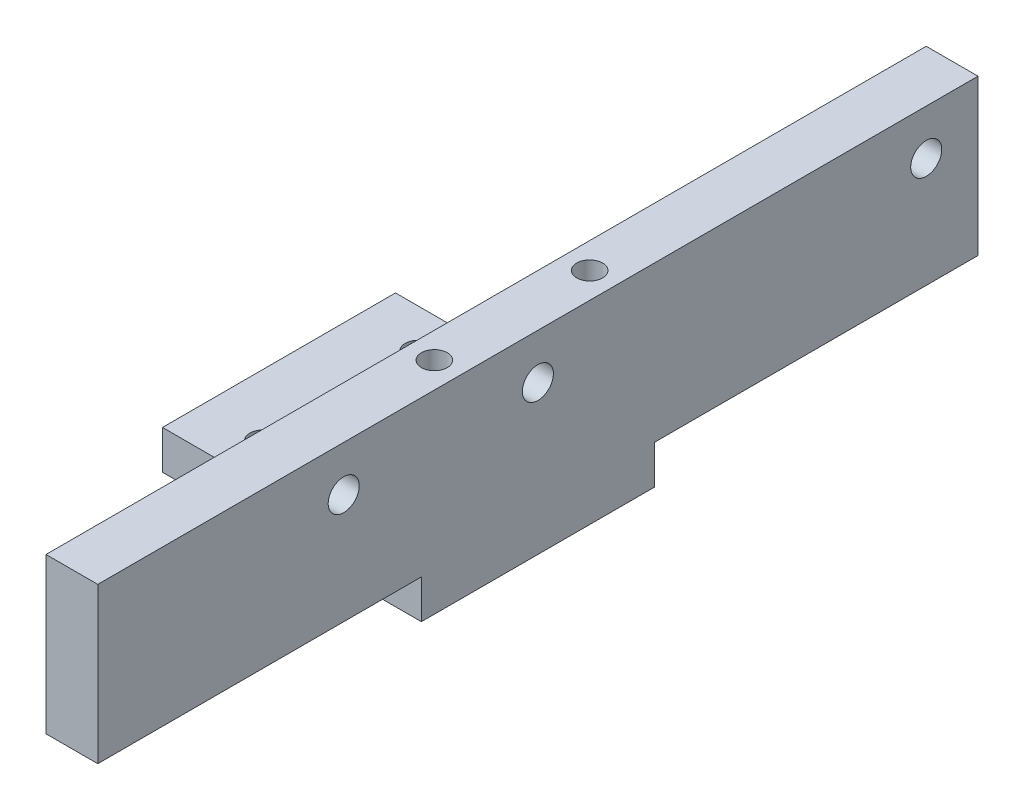
ISO-10303-21;
HEADER;
FILE_DESCRIPTION(('STEP AP214'),'2;1');
FILE_NAME('part.step','',(''),(''),'','','');
FILE_SCHEMA(('AUTOMOTIVE_DESIGN { 1 0 10303 214 1 1 1 1 }'));
ENDSEC;
DATA;
#1=APPLICATION_CONTEXT('core data for automotive mechanical design processes');
#2=APPLICATION_PROTOCOL_DEFINITION('international standard','automotive_design',2000,#1);
#3=PRODUCT_CONTEXT('',#1,'mechanical');
#4=PRODUCT('Part','Part','',(#3));
#5=PRODUCT_RELATED_PRODUCT_CATEGORY('part','',(#4));
#6=PRODUCT_DEFINITION_FORMATION('','',#4);
#7=PRODUCT_DEFINITION_CONTEXT('part definition',#1,'design');
#8=PRODUCT_DEFINITION('design','',#6,#7);
#9=PRODUCT_DEFINITION_SHAPE('','',#8);
#10=(LENGTH_UNIT() NAMED_UNIT(*) SI_UNIT(.MILLI.,.METRE.));
#11=(NAMED_UNIT(*) PLANE_ANGLE_UNIT() SI_UNIT($,.RADIAN.));
#12=(NAMED_UNIT(*) SI_UNIT($,.STERADIAN.) SOLID_ANGLE_UNIT());
#13=UNCERTAINTY_MEASURE_WITH_UNIT(LENGTH_MEASURE(1.E-05),#10,'distance_accuracy_value','');
#14=(GEOMETRIC_REPRESENTATION_CONTEXT(3) GLOBAL_UNCERTAINTY_ASSIGNED_CONTEXT((#13)) GLOBAL_UNIT_ASSIGNED_CONTEXT((#10,
#11,#12)) REPRESENTATION_CONTEXT('',''));
#15=CARTESIAN_POINT('',(0.,0.,0.));
#16=DIRECTION('',(0.,0.,1.));
#17=DIRECTION('',(1.,0.,0.));
#18=AXIS2_PLACEMENT_3D('',#15,#16,#17);
#19=CARTESIAN_POINT('',(5.,3.,18.));
#20=DIRECTION('',(0.,0.,-1.));
#21=DIRECTION('',(-1.,0.,0.));
#22=AXIS2_PLACEMENT_3D('',#19,#20,#21);
#23=PLANE('',#22);
#24=DIRECTION('',(1.,0.,0.));
#25=VECTOR('',#24,1.);
#26=CARTESIAN_POINT('',(25.,3.,18.));
#27=LINE('',#26,#25);
#28=CARTESIAN_POINT('',(21.,3.,18.));
#29=VERTEX_POINT('',#28);
#30=CARTESIAN_POINT('',(25.,3.,18.));
#31=VERTEX_POINT('',#30);
#32=EDGE_CURVE('E166',#29,#31,#27,.T.);
#33=ORIENTED_EDGE('',*,*,#32,.F.);
#34=DIRECTION('',(1.,0.,0.));
#35=VECTOR('',#34,1.);
#36=CARTESIAN_POINT('',(5.,3.,18.));
#37=LINE('',#36,#35);
#38=CARTESIAN_POINT('',(5.,3.,18.));
#39=VERTEX_POINT('',#38);
#40=EDGE_CURVE('E84',#39,#29,#37,.T.);
#41=ORIENTED_EDGE('',*,*,#40,.F.);
#42=DIRECTION('',(0.,-1.,0.));
#43=VECTOR('',#42,1.);
#44=CARTESIAN_POINT('',(5.,3.,18.));
#45=LINE('',#44,#43);
#46=CARTESIAN_POINT('',(5.,0.,18.));
#47=VERTEX_POINT('',#46);
#48=EDGE_CURVE('E62',#39,#47,#45,.T.);
#49=ORIENTED_EDGE('',*,*,#48,.T.);
#50=DIRECTION('',(1.,0.,0.));
#51=VECTOR('',#50,1.);
#52=CARTESIAN_POINT('',(5.,0.,18.));
#53=LINE('',#52,#51);
#54=CARTESIAN_POINT('',(25.,0.,18.));
#55=VERTEX_POINT('',#54);
#56=EDGE_CURVE('E81',#47,#55,#53,.T.);
#57=ORIENTED_EDGE('',*,*,#56,.T.);
#58=DIRECTION('',(0.,-1.,0.));
#59=VECTOR('',#58,1.);
#60=CARTESIAN_POINT('',(25.,3.,18.));
#61=LINE('',#60,#59);
#62=EDGE_CURVE('E11',#31,#55,#61,.T.);
#63=ORIENTED_EDGE('',*,*,#62,.F.);
#64=EDGE_LOOP('',(#33,#41,#49,#57,#63));
#65=FACE_BOUND('',#64,.T.);
#66=ADVANCED_FACE('F39',(#65),#23,.F.);
#67=CARTESIAN_POINT('',(0.,3.,0.));
#68=DIRECTION('',(0.,-1.,0.));
#69=DIRECTION('',(0.,0.,-1.));
#70=AXIS2_PLACEMENT_3D('',#67,#68,#69);
#71=PLANE('',#70);
#72=CARTESIAN_POINT('',(9.75000000000003,3.,15.));
#73=DIRECTION('',(0.,-1.,0.));
#74=DIRECTION('',(0.,0.,-1.));
#75=AXIS2_PLACEMENT_3D('',#72,#73,#74);
#76=CIRCLE('',#75,1.);
#77=CARTESIAN_POINT('',(9.75000000000003,3.,14.));
#78=VERTEX_POINT('',#77);
#79=EDGE_CURVE('E120',#78,#78,#76,.T.);
#80=ORIENTED_EDGE('',*,*,#79,.T.);
#81=EDGE_LOOP('',(#80));
#82=FACE_BOUND('',#81,.T.);
#83=CARTESIAN_POINT('',(9.75000000000003,3.,3.00000000000001));
#84=DIRECTION('',(0.,-1.,0.));
#85=DIRECTION('',(0.,0.,-1.));
#86=AXIS2_PLACEMENT_3D('',#83,#84,#85);
#87=CIRCLE('',#86,1.);
#88=CARTESIAN_POINT('',(9.75000000000003,3.,2.00000000000001));
#89=VERTEX_POINT('',#88);
#90=EDGE_CURVE('E127',#89,#89,#87,.T.);
#91=ORIENTED_EDGE('',*,*,#90,.T.);
#92=EDGE_LOOP('',(#91));
#93=FACE_BOUND('',#92,.T.);
#94=CARTESIAN_POINT('',(17.75,3.,3.00000000000001));
#95=DIRECTION('',(0.,-1.,0.));
#96=DIRECTION('',(0.,0.,-1.));
#97=AXIS2_PLACEMENT_3D('',#94,#95,#96);
#98=CIRCLE('',#97,1.);
#99=CARTESIAN_POINT('',(17.75,3.,2.00000000000001));
#100=VERTEX_POINT('',#99);
#101=EDGE_CURVE('E130',#100,#100,#98,.T.);
#102=ORIENTED_EDGE('',*,*,#101,.T.);
#103=EDGE_LOOP('',(#102));
#104=FACE_BOUND('',#103,.T.);
#105=CARTESIAN_POINT('',(17.75,3.,15.));
#106=DIRECTION('',(0.,-1.,0.));
#107=DIRECTION('',(0.,0.,-1.));
#108=AXIS2_PLACEMENT_3D('',#105,#106,#107);
#109=CIRCLE('',#108,1.);
#110=CARTESIAN_POINT('',(17.75,3.,14.));
#111=VERTEX_POINT('',#110);
#112=EDGE_CURVE('E133',#111,#111,#109,.T.);
#113=ORIENTED_EDGE('',*,*,#112,.T.);
#114=EDGE_LOOP('',(#113));
#115=FACE_BOUND('',#114,.T.);
#116=DIRECTION('',(0.,0.,1.));
#117=VECTOR('',#116,1.);
#118=CARTESIAN_POINT('',(21.,3.,0.));
#119=LINE('',#118,#117);
#120=CARTESIAN_POINT('',(21.,3.,0.));
#121=VERTEX_POINT('',#120);
#122=EDGE_CURVE('E116',#121,#29,#119,.T.);
#123=ORIENTED_EDGE('',*,*,#122,.F.);
#124=DIRECTION('',(1.,0.,0.));
#125=VECTOR('',#124,1.);
#126=CARTESIAN_POINT('',(5.,3.,0.));
#127=LINE('',#126,#125);
#128=CARTESIAN_POINT('',(5.,3.,0.));
#129=VERTEX_POINT('',#128);
#130=EDGE_CURVE('E102',#129,#121,#127,.T.);
#131=ORIENTED_EDGE('',*,*,#130,.F.);
#132=DIRECTION('',(0.,0.,-1.));
#133=VECTOR('',#132,1.);
#134=CARTESIAN_POINT('',(5.,3.,18.));
#135=LINE('',#134,#133);
#136=EDGE_CURVE('E87',#39,#129,#135,.T.);
#137=ORIENTED_EDGE('',*,*,#136,.F.);
#138=ORIENTED_EDGE('',*,*,#40,.T.);
#139=EDGE_LOOP('',(#123,#131,#137,#138));
#140=FACE_BOUND('',#139,.T.);
#141=ADVANCED_FACE('F231',(#82,#93,#104,#115,#140),#71,.F.);
#142=CARTESIAN_POINT('',(25.,3.,0.));
#143=DIRECTION('',(1.,0.,0.));
#144=DIRECTION('',(0.,0.,-1.));
#145=AXIS2_PLACEMENT_3D('',#142,#143,#144);
#146=PLANE('',#145);
#147=CARTESIAN_POINT('',(25.,11.5,-21.0000000000001));
#148=DIRECTION('',(1.,0.,0.));
#149=DIRECTION('',(0.,0.,-1.));
#150=AXIS2_PLACEMENT_3D('',#147,#148,#149);
#151=CIRCLE('',#150,1.20000000000002);
#152=CARTESIAN_POINT('',(25.,11.5,-22.2000000000001));
#153=VERTEX_POINT('',#152);
#154=EDGE_CURVE('E209',#153,#153,#151,.F.);
#155=ORIENTED_EDGE('',*,*,#154,.T.);
#156=EDGE_LOOP('',(#155));
#157=FACE_BOUND('',#156,.T.);
#158=CARTESIAN_POINT('',(25.,11.5,8.99999999999994));
#159=DIRECTION('',(1.,0.,0.));
#160=DIRECTION('',(0.,0.,-1.));
#161=AXIS2_PLACEMENT_3D('',#158,#159,#160);
#162=CIRCLE('',#161,1.20000000000002);
#163=CARTESIAN_POINT('',(25.,11.5,7.79999999999992));
#164=VERTEX_POINT('',#163);
#165=EDGE_CURVE('E202',#164,#164,#162,.F.);
#166=ORIENTED_EDGE('',*,*,#165,.T.);
#167=EDGE_LOOP('',(#166));
#168=FACE_BOUND('',#167,.T.);
#169=CARTESIAN_POINT('',(25.,11.5,23.9999999999999));
#170=DIRECTION('',(1.,0.,0.));
#171=DIRECTION('',(0.,0.,-1.));
#172=AXIS2_PLACEMENT_3D('',#169,#170,#171);
#173=CIRCLE('',#172,1.20000000000002);
#174=CARTESIAN_POINT('',(25.,11.5,22.7999999999999));
#175=VERTEX_POINT('',#174);
#176=EDGE_CURVE('E203',#175,#175,#173,.F.);
#177=ORIENTED_EDGE('',*,*,#176,.T.);
#178=EDGE_LOOP('',(#177));
#179=FACE_BOUND('',#178,.T.);
#180=DIRECTION('',(0.,0.,1.));
#181=VECTOR('',#180,1.);
#182=CARTESIAN_POINT('',(25.,0.,0.));
#183=LINE('',#182,#181);
#184=CARTESIAN_POINT('',(25.,0.,0.));
#185=VERTEX_POINT('',#184);
#186=EDGE_CURVE('E95',#185,#55,#183,.T.);
#187=ORIENTED_EDGE('',*,*,#186,.F.);
#188=DIRECTION('',(0.,-1.,0.));
#189=VECTOR('',#188,1.);
#190=CARTESIAN_POINT('',(25.,3.,0.));
#191=LINE('',#190,#189);
#192=CARTESIAN_POINT('',(25.,3.,0.));
#193=VERTEX_POINT('',#192);
#194=EDGE_CURVE('E46',#193,#185,#191,.T.);
#195=ORIENTED_EDGE('',*,*,#194,.F.);
#196=DIRECTION('',(0.,0.,1.));
#197=VECTOR('',#196,1.);
#198=CARTESIAN_POINT('',(25.,3.,-25.));
#199=LINE('',#198,#197);
#200=CARTESIAN_POINT('',(25.,3.,-25.));
#201=VERTEX_POINT('',#200);
#202=EDGE_CURVE('E170',#201,#193,#199,.T.);
#203=ORIENTED_EDGE('',*,*,#202,.F.);
#204=DIRECTION('',(0.,-1.,0.));
#205=VECTOR('',#204,1.);
#206=CARTESIAN_POINT('',(25.,15.,-25.));
#207=LINE('',#206,#205);
#208=CARTESIAN_POINT('',(25.,15.,-25.));
#209=VERTEX_POINT('',#208);
#210=EDGE_CURVE('E187',#209,#201,#207,.T.);
#211=ORIENTED_EDGE('',*,*,#210,.F.);
#212=DIRECTION('',(0.,0.,-1.));
#213=VECTOR('',#212,1.);
#214=CARTESIAN_POINT('',(25.,15.,0.));
#215=LINE('',#214,#213);
#216=CARTESIAN_POINT('',(25.,15.,43.));
#217=VERTEX_POINT('',#216);
#218=EDGE_CURVE('E119',#217,#209,#215,.T.);
#219=ORIENTED_EDGE('',*,*,#218,.F.);
#220=DIRECTION('',(0.,1.,0.));
#221=VECTOR('',#220,1.);
#222=CARTESIAN_POINT('',(25.,15.,43.));
#223=LINE('',#222,#221);
#224=CARTESIAN_POINT('',(25.,3.,43.));
#225=VERTEX_POINT('',#224);
#226=EDGE_CURVE('E169',#225,#217,#223,.T.);
#227=ORIENTED_EDGE('',*,*,#226,.F.);
#228=DIRECTION('',(0.,0.,-1.));
#229=VECTOR('',#228,1.);
#230=CARTESIAN_POINT('',(25.,3.,43.));
#231=LINE('',#230,#229);
#232=EDGE_CURVE('E163',#225,#31,#231,.T.);
#233=ORIENTED_EDGE('',*,*,#232,.T.);
#234=ORIENTED_EDGE('',*,*,#62,.T.);
#235=EDGE_LOOP('',(#187,#195,#203,#211,#219,#227,#233,#234));
#236=FACE_BOUND('',#235,.T.);
#237=ADVANCED_FACE('F111',(#157,#168,#179,#236),#146,.T.);
#238=CARTESIAN_POINT('',(5.,3.,0.));
#239=DIRECTION('',(0.,0.,-1.));
#240=DIRECTION('',(-1.,0.,0.));
#241=AXIS2_PLACEMENT_3D('',#238,#239,#240);
#242=PLANE('',#241);
#243=DIRECTION('',(-1.,0.,0.));
#244=VECTOR('',#243,1.);
#245=CARTESIAN_POINT('',(25.,3.,0.));
#246=LINE('',#245,#244);
#247=EDGE_CURVE('E53',#193,#121,#246,.T.);
#248=ORIENTED_EDGE('',*,*,#247,.F.);
#249=ORIENTED_EDGE('',*,*,#194,.T.);
#250=DIRECTION('',(1.,0.,0.));
#251=VECTOR('',#250,1.);
#252=CARTESIAN_POINT('',(5.,0.,0.));
#253=LINE('',#252,#251);
#254=CARTESIAN_POINT('',(5.,0.,0.));
#255=VERTEX_POINT('',#254);
#256=EDGE_CURVE('E100',#255,#185,#253,.T.);
#257=ORIENTED_EDGE('',*,*,#256,.F.);
#258=DIRECTION('',(0.,-1.,0.));
#259=VECTOR('',#258,1.);
#260=CARTESIAN_POINT('',(5.,3.,0.));
#261=LINE('',#260,#259);
#262=EDGE_CURVE('E86',#129,#255,#261,.T.);
#263=ORIENTED_EDGE('',*,*,#262,.F.);
#264=ORIENTED_EDGE('',*,*,#130,.T.);
#265=EDGE_LOOP('',(#248,#249,#257,#263,#264));
#266=FACE_BOUND('',#265,.T.);
#267=ADVANCED_FACE('F107',(#266),#242,.T.);
#268=CARTESIAN_POINT('',(5.,3.,18.));
#269=DIRECTION('',(-1.,0.,0.));
#270=DIRECTION('',(0.,0.,1.));
#271=AXIS2_PLACEMENT_3D('',#268,#269,#270);
#272=PLANE('',#271);
#273=DIRECTION('',(0.,0.,-1.));
#274=VECTOR('',#273,1.);
#275=CARTESIAN_POINT('',(5.,0.,18.));
#276=LINE('',#275,#274);
#277=EDGE_CURVE('E93',#47,#255,#276,.T.);
#278=ORIENTED_EDGE('',*,*,#277,.F.);
#279=ORIENTED_EDGE('',*,*,#48,.F.);
#280=ORIENTED_EDGE('',*,*,#136,.T.);
#281=ORIENTED_EDGE('',*,*,#262,.T.);
#282=EDGE_LOOP('',(#278,#279,#280,#281));
#283=FACE_BOUND('',#282,.T.);
#284=ADVANCED_FACE('F98',(#283),#272,.T.);
#285=CARTESIAN_POINT('',(0.,0.,0.));
#286=DIRECTION('',(0.,-1.,0.));
#287=DIRECTION('',(0.,0.,-1.));
#288=AXIS2_PLACEMENT_3D('',#285,#286,#287);
#289=PLANE('',#288);
#290=CARTESIAN_POINT('',(9.75000000000003,0.,15.));
#291=DIRECTION('',(0.,-1.,0.));
#292=DIRECTION('',(0.,0.,-1.));
#293=AXIS2_PLACEMENT_3D('',#290,#291,#292);
#294=CIRCLE('',#293,1.);
#295=CARTESIAN_POINT('',(9.75000000000003,0.,14.));
#296=VERTEX_POINT('',#295);
#297=EDGE_CURVE('E140',#296,#296,#294,.T.);
#298=ORIENTED_EDGE('',*,*,#297,.F.);
#299=EDGE_LOOP('',(#298));
#300=FACE_BOUND('',#299,.T.);
#301=CARTESIAN_POINT('',(9.75000000000003,0.,3.00000000000001));
#302=DIRECTION('',(0.,-1.,0.));
#303=DIRECTION('',(0.,0.,-1.));
#304=AXIS2_PLACEMENT_3D('',#301,#302,#303);
#305=CIRCLE('',#304,1.);
#306=CARTESIAN_POINT('',(9.75000000000003,0.,2.00000000000001));
#307=VERTEX_POINT('',#306);
#308=EDGE_CURVE('E143',#307,#307,#305,.T.);
#309=ORIENTED_EDGE('',*,*,#308,.F.);
#310=EDGE_LOOP('',(#309));
#311=FACE_BOUND('',#310,.T.);
#312=CARTESIAN_POINT('',(17.75,0.,3.00000000000001));
#313=DIRECTION('',(0.,-1.,0.));
#314=DIRECTION('',(0.,0.,-1.));
#315=AXIS2_PLACEMENT_3D('',#312,#313,#314);
#316=CIRCLE('',#315,1.);
#317=CARTESIAN_POINT('',(17.75,0.,2.00000000000001));
#318=VERTEX_POINT('',#317);
#319=EDGE_CURVE('E139',#318,#318,#316,.T.);
#320=ORIENTED_EDGE('',*,*,#319,.F.);
#321=EDGE_LOOP('',(#320));
#322=FACE_BOUND('',#321,.T.);
#323=CARTESIAN_POINT('',(17.75,0.,15.));
#324=DIRECTION('',(0.,-1.,0.));
#325=DIRECTION('',(0.,0.,-1.));
#326=AXIS2_PLACEMENT_3D('',#323,#324,#325);
#327=CIRCLE('',#326,1.);
#328=CARTESIAN_POINT('',(17.75,0.,14.));
#329=VERTEX_POINT('',#328);
#330=EDGE_CURVE('E136',#329,#329,#327,.T.);
#331=ORIENTED_EDGE('',*,*,#330,.F.);
#332=EDGE_LOOP('',(#331));
#333=FACE_BOUND('',#332,.T.);
#334=ORIENTED_EDGE('',*,*,#56,.F.);
#335=ORIENTED_EDGE('',*,*,#277,.T.);
#336=ORIENTED_EDGE('',*,*,#256,.T.);
#337=ORIENTED_EDGE('',*,*,#186,.T.);
#338=EDGE_LOOP('',(#334,#335,#336,#337));
#339=FACE_BOUND('',#338,.T.);
#340=ADVANCED_FACE('F91',(#300,#311,#322,#333,#339),#289,.T.);
#341=CARTESIAN_POINT('',(21.,15.,0.));
#342=DIRECTION('',(1.,0.,0.));
#343=DIRECTION('',(0.,0.,-1.));
#344=AXIS2_PLACEMENT_3D('',#341,#342,#343);
#345=PLANE('',#344);
#346=CARTESIAN_POINT('',(21.,11.5,-21.0000000000001));
#347=DIRECTION('',(-1.,0.,0.));
#348=DIRECTION('',(0.,0.,1.));
#349=AXIS2_PLACEMENT_3D('',#346,#347,#348);
#350=CIRCLE('',#349,1.20000000000002);
#351=CARTESIAN_POINT('',(21.,11.5,-19.8));
#352=VERTEX_POINT('',#351);
#353=EDGE_CURVE('E188',#352,#352,#350,.T.);
#354=ORIENTED_EDGE('',*,*,#353,.F.);
#355=EDGE_LOOP('',(#354));
#356=FACE_BOUND('',#355,.T.);
#357=CARTESIAN_POINT('',(21.,11.5,8.99999999999994));
#358=DIRECTION('',(-1.,0.,0.));
#359=DIRECTION('',(0.,0.,1.));
#360=AXIS2_PLACEMENT_3D('',#357,#358,#359);
#361=CIRCLE('',#360,1.20000000000002);
#362=CARTESIAN_POINT('',(21.,11.5,10.2));
#363=VERTEX_POINT('',#362);
#364=EDGE_CURVE('E206',#363,#363,#361,.T.);
#365=ORIENTED_EDGE('',*,*,#364,.F.);
#366=EDGE_LOOP('',(#365));
#367=FACE_BOUND('',#366,.T.);
#368=CARTESIAN_POINT('',(21.,11.5,23.9999999999999));
#369=DIRECTION('',(-1.,0.,0.));
#370=DIRECTION('',(0.,0.,1.));
#371=AXIS2_PLACEMENT_3D('',#368,#369,#370);
#372=CIRCLE('',#371,1.20000000000002);
#373=CARTESIAN_POINT('',(21.,11.5,25.2));
#374=VERTEX_POINT('',#373);
#375=EDGE_CURVE('E199',#374,#374,#372,.T.);
#376=ORIENTED_EDGE('',*,*,#375,.F.);
#377=EDGE_LOOP('',(#376));
#378=FACE_BOUND('',#377,.T.);
#379=ORIENTED_EDGE('',*,*,#122,.T.);
#380=DIRECTION('',(0.,0.,-1.));
#381=VECTOR('',#380,1.);
#382=CARTESIAN_POINT('',(21.,3.,43.));
#383=LINE('',#382,#381);
#384=CARTESIAN_POINT('',(21.,3.,43.));
#385=VERTEX_POINT('',#384);
#386=EDGE_CURVE('E153',#385,#29,#383,.T.);
#387=ORIENTED_EDGE('',*,*,#386,.F.);
#388=DIRECTION('',(0.,-1.,0.));
#389=VECTOR('',#388,1.);
#390=CARTESIAN_POINT('',(21.,15.,43.));
#391=LINE('',#390,#389);
#392=CARTESIAN_POINT('',(21.,15.,43.));
#393=VERTEX_POINT('',#392);
#394=EDGE_CURVE('E173',#393,#385,#391,.T.);
#395=ORIENTED_EDGE('',*,*,#394,.F.);
#396=DIRECTION('',(0.,0.,1.));
#397=VECTOR('',#396,1.);
#398=CARTESIAN_POINT('',(21.,15.,0.));
#399=LINE('',#398,#397);
#400=CARTESIAN_POINT('',(21.,15.,-25.));
#401=VERTEX_POINT('',#400);
#402=EDGE_CURVE('E96',#401,#393,#399,.T.);
#403=ORIENTED_EDGE('',*,*,#402,.F.);
#404=DIRECTION('',(0.,1.,0.));
#405=VECTOR('',#404,1.);
#406=CARTESIAN_POINT('',(21.,15.,-25.));
#407=LINE('',#406,#405);
#408=CARTESIAN_POINT('',(21.,3.,-25.));
#409=VERTEX_POINT('',#408);
#410=EDGE_CURVE('E191',#409,#401,#407,.T.);
#411=ORIENTED_EDGE('',*,*,#410,.F.);
#412=DIRECTION('',(0.,0.,1.));
#413=VECTOR('',#412,1.);
#414=CARTESIAN_POINT('',(21.,3.,-25.));
#415=LINE('',#414,#413);
#416=EDGE_CURVE('E182',#409,#121,#415,.T.);
#417=ORIENTED_EDGE('',*,*,#416,.T.);
#418=EDGE_LOOP('',(#379,#387,#395,#403,#411,#417));
#419=FACE_BOUND('',#418,.T.);
#420=ADVANCED_FACE('F243',(#356,#367,#378,#419),#345,.F.);
#421=CARTESIAN_POINT('',(0.,15.,0.));
#422=DIRECTION('',(0.,-1.,0.));
#423=DIRECTION('',(0.,0.,-1.));
#424=AXIS2_PLACEMENT_3D('',#421,#422,#423);
#425=PLANE('',#424);
#426=CARTESIAN_POINT('',(23.,15.,15.));
#427=DIRECTION('',(0.,1.,0.));
#428=DIRECTION('',(0.,0.,1.));
#429=AXIS2_PLACEMENT_3D('',#426,#427,#428);
#430=CIRCLE('',#429,1.);
#431=CARTESIAN_POINT('',(23.,15.,16.));
#432=VERTEX_POINT('',#431);
#433=EDGE_CURVE('E156',#432,#432,#430,.T.);
#434=ORIENTED_EDGE('',*,*,#433,.F.);
#435=EDGE_LOOP('',(#434));
#436=FACE_BOUND('',#435,.T.);
#437=CARTESIAN_POINT('',(23.,15.,3.));
#438=DIRECTION('',(0.,1.,0.));
#439=DIRECTION('',(0.,0.,1.));
#440=AXIS2_PLACEMENT_3D('',#437,#438,#439);
#441=CIRCLE('',#440,1.);
#442=CARTESIAN_POINT('',(23.,15.,4.));
#443=VERTEX_POINT('',#442);
#444=EDGE_CURVE('E152',#443,#443,#441,.T.);
#445=ORIENTED_EDGE('',*,*,#444,.F.);
#446=EDGE_LOOP('',(#445));
#447=FACE_BOUND('',#446,.T.);
#448=ORIENTED_EDGE('',*,*,#218,.T.);
#449=DIRECTION('',(1.,0.,0.));
#450=VECTOR('',#449,1.);
#451=CARTESIAN_POINT('',(25.,15.,-25.));
#452=LINE('',#451,#450);
#453=EDGE_CURVE('E185',#401,#209,#452,.T.);
#454=ORIENTED_EDGE('',*,*,#453,.F.);
#455=ORIENTED_EDGE('',*,*,#402,.T.);
#456=DIRECTION('',(-1.,0.,0.));
#457=VECTOR('',#456,1.);
#458=CARTESIAN_POINT('',(25.,15.,43.));
#459=LINE('',#458,#457);
#460=EDGE_CURVE('E176',#217,#393,#459,.T.);
#461=ORIENTED_EDGE('',*,*,#460,.F.);
#462=EDGE_LOOP('',(#448,#454,#455,#461));
#463=FACE_BOUND('',#462,.T.);
#464=ADVANCED_FACE('F272',(#436,#447,#463),#425,.F.);
#465=CARTESIAN_POINT('',(17.75,15.,15.));
#466=DIRECTION('',(0.,-1.,0.));
#467=DIRECTION('',(0.,0.,-1.));
#468=AXIS2_PLACEMENT_3D('',#465,#466,#467);
#469=CYLINDRICAL_SURFACE('',#468,1.);
#470=ORIENTED_EDGE('',*,*,#330,.T.);
#471=EDGE_LOOP('',(#470));
#472=FACE_BOUND('',#471,.T.);
#473=ORIENTED_EDGE('',*,*,#112,.F.);
#474=EDGE_LOOP('',(#473));
#475=FACE_BOUND('',#474,.T.);
#476=ADVANCED_FACE('F279',(#472,#475),#469,.F.);
#477=CARTESIAN_POINT('',(17.75,15.,3.00000000000001));
#478=DIRECTION('',(0.,-1.,0.));
#479=DIRECTION('',(0.,0.,-1.));
#480=AXIS2_PLACEMENT_3D('',#477,#478,#479);
#481=CYLINDRICAL_SURFACE('',#480,1.);
#482=ORIENTED_EDGE('',*,*,#319,.T.);
#483=EDGE_LOOP('',(#482));
#484=FACE_BOUND('',#483,.T.);
#485=ORIENTED_EDGE('',*,*,#101,.F.);
#486=EDGE_LOOP('',(#485));
#487=FACE_BOUND('',#486,.T.);
#488=ADVANCED_FACE('F286',(#484,#487),#481,.F.);
#489=CARTESIAN_POINT('',(9.75000000000003,15.,3.00000000000001));
#490=DIRECTION('',(0.,-1.,0.));
#491=DIRECTION('',(0.,0.,-1.));
#492=AXIS2_PLACEMENT_3D('',#489,#490,#491);
#493=CYLINDRICAL_SURFACE('',#492,1.);
#494=ORIENTED_EDGE('',*,*,#308,.T.);
#495=EDGE_LOOP('',(#494));
#496=FACE_BOUND('',#495,.T.);
#497=ORIENTED_EDGE('',*,*,#90,.F.);
#498=EDGE_LOOP('',(#497));
#499=FACE_BOUND('',#498,.T.);
#500=ADVANCED_FACE('F294',(#496,#499),#493,.F.);
#501=CARTESIAN_POINT('',(9.75000000000003,15.,15.));
#502=DIRECTION('',(0.,-1.,0.));
#503=DIRECTION('',(0.,0.,-1.));
#504=AXIS2_PLACEMENT_3D('',#501,#502,#503);
#505=CYLINDRICAL_SURFACE('',#504,1.);
#506=ORIENTED_EDGE('',*,*,#297,.T.);
#507=EDGE_LOOP('',(#506));
#508=FACE_BOUND('',#507,.T.);
#509=ORIENTED_EDGE('',*,*,#79,.F.);
#510=EDGE_LOOP('',(#509));
#511=FACE_BOUND('',#510,.T.);
#512=ADVANCED_FACE('F302',(#508,#511),#505,.F.);
#513=CARTESIAN_POINT('',(23.,10.,3.));
#514=DIRECTION('',(0.,1.,0.));
#515=DIRECTION('',(0.,0.,1.));
#516=AXIS2_PLACEMENT_3D('',#513,#514,#515);
#517=CYLINDRICAL_SURFACE('',#516,1.);
#518=CARTESIAN_POINT('',(23.,10.,3.));
#519=DIRECTION('',(0.,1.,0.));
#520=DIRECTION('',(0.,0.,1.));
#521=AXIS2_PLACEMENT_3D('',#518,#519,#520);
#522=CIRCLE('',#521,1.);
#523=CARTESIAN_POINT('',(23.,10.,4.));
#524=VERTEX_POINT('',#523);
#525=EDGE_CURVE('E149',#524,#524,#522,.T.);
#526=ORIENTED_EDGE('',*,*,#525,.F.);
#527=EDGE_LOOP('',(#526));
#528=FACE_BOUND('',#527,.T.);
#529=ORIENTED_EDGE('',*,*,#444,.T.);
#530=EDGE_LOOP('',(#529));
#531=FACE_BOUND('',#530,.T.);
#532=ADVANCED_FACE('F310',(#528,#531),#517,.F.);
#533=CARTESIAN_POINT('',(23.,10.,3.));
#534=DIRECTION('',(0.,1.,0.));
#535=DIRECTION('',(0.,0.,1.));
#536=AXIS2_PLACEMENT_3D('',#533,#534,#535);
#537=PLANE('',#536);
#538=ORIENTED_EDGE('',*,*,#525,.T.);
#539=EDGE_LOOP('',(#538));
#540=FACE_BOUND('',#539,.T.);
#541=ADVANCED_FACE('F318',(#540),#537,.T.);
#542=CARTESIAN_POINT('',(23.,10.,15.));
#543=DIRECTION('',(0.,1.,0.));
#544=DIRECTION('',(0.,0.,1.));
#545=AXIS2_PLACEMENT_3D('',#542,#543,#544);
#546=CYLINDRICAL_SURFACE('',#545,1.);
#547=CARTESIAN_POINT('',(23.,10.,15.));
#548=DIRECTION('',(0.,1.,0.));
#549=DIRECTION('',(0.,0.,1.));
#550=AXIS2_PLACEMENT_3D('',#547,#548,#549);
#551=CIRCLE('',#550,1.);
#552=CARTESIAN_POINT('',(23.,10.,16.));
#553=VERTEX_POINT('',#552);
#554=EDGE_CURVE('E144',#553,#553,#551,.T.);
#555=ORIENTED_EDGE('',*,*,#554,.F.);
#556=EDGE_LOOP('',(#555));
#557=FACE_BOUND('',#556,.T.);
#558=ORIENTED_EDGE('',*,*,#433,.T.);
#559=EDGE_LOOP('',(#558));
#560=FACE_BOUND('',#559,.T.);
#561=ADVANCED_FACE('F326',(#557,#560),#546,.F.);
#562=CARTESIAN_POINT('',(23.,10.,15.));
#563=DIRECTION('',(0.,1.,0.));
#564=DIRECTION('',(0.,0.,1.));
#565=AXIS2_PLACEMENT_3D('',#562,#563,#564);
#566=PLANE('',#565);
#567=ORIENTED_EDGE('',*,*,#554,.T.);
#568=EDGE_LOOP('',(#567));
#569=FACE_BOUND('',#568,.T.);
#570=ADVANCED_FACE('F334',(#569),#566,.T.);
#571=CARTESIAN_POINT('',(25.,3.,43.));
#572=DIRECTION('',(0.,1.,0.));
#573=DIRECTION('',(0.,0.,1.));
#574=AXIS2_PLACEMENT_3D('',#571,#572,#573);
#575=PLANE('',#574);
#576=ORIENTED_EDGE('',*,*,#32,.T.);
#577=ORIENTED_EDGE('',*,*,#232,.F.);
#578=DIRECTION('',(1.,0.,0.));
#579=VECTOR('',#578,1.);
#580=CARTESIAN_POINT('',(25.,3.,43.));
#581=LINE('',#580,#579);
#582=EDGE_CURVE('E165',#385,#225,#581,.T.);
#583=ORIENTED_EDGE('',*,*,#582,.F.);
#584=ORIENTED_EDGE('',*,*,#386,.T.);
#585=EDGE_LOOP('',(#576,#577,#583,#584));
#586=FACE_BOUND('',#585,.T.);
#587=ADVANCED_FACE('F342',(#586),#575,.F.);
#588=CARTESIAN_POINT('',(0.,0.,43.));
#589=DIRECTION('',(0.,0.,-1.));
#590=DIRECTION('',(-1.,0.,0.));
#591=AXIS2_PLACEMENT_3D('',#588,#589,#590);
#592=PLANE('',#591);
#593=ORIENTED_EDGE('',*,*,#226,.T.);
#594=ORIENTED_EDGE('',*,*,#460,.T.);
#595=ORIENTED_EDGE('',*,*,#394,.T.);
#596=ORIENTED_EDGE('',*,*,#582,.T.);
#597=EDGE_LOOP('',(#593,#594,#595,#596));
#598=FACE_BOUND('',#597,.T.);
#599=ADVANCED_FACE('F350',(#598),#592,.F.);
#600=CARTESIAN_POINT('',(25.,3.,-25.));
#601=DIRECTION('',(0.,1.,0.));
#602=DIRECTION('',(0.,0.,1.));
#603=AXIS2_PLACEMENT_3D('',#600,#601,#602);
#604=PLANE('',#603);
#605=ORIENTED_EDGE('',*,*,#247,.T.);
#606=ORIENTED_EDGE('',*,*,#416,.F.);
#607=DIRECTION('',(-1.,0.,0.));
#608=VECTOR('',#607,1.);
#609=CARTESIAN_POINT('',(25.,3.,-25.));
#610=LINE('',#609,#608);
#611=EDGE_CURVE('E194',#201,#409,#610,.T.);
#612=ORIENTED_EDGE('',*,*,#611,.F.);
#613=ORIENTED_EDGE('',*,*,#202,.T.);
#614=EDGE_LOOP('',(#605,#606,#612,#613));
#615=FACE_BOUND('',#614,.T.);
#616=ADVANCED_FACE('F357',(#615),#604,.F.);
#617=CARTESIAN_POINT('',(0.,0.,-25.));
#618=DIRECTION('',(0.,0.,-1.));
#619=DIRECTION('',(-1.,0.,0.));
#620=AXIS2_PLACEMENT_3D('',#617,#618,#619);
#621=PLANE('',#620);
#622=ORIENTED_EDGE('',*,*,#210,.T.);
#623=ORIENTED_EDGE('',*,*,#611,.T.);
#624=ORIENTED_EDGE('',*,*,#410,.T.);
#625=ORIENTED_EDGE('',*,*,#453,.T.);
#626=EDGE_LOOP('',(#622,#623,#624,#625));
#627=FACE_BOUND('',#626,.T.);
#628=ADVANCED_FACE('F364',(#627),#621,.T.);
#629=CARTESIAN_POINT('',(28.3941125496955,11.5,23.9999999999999));
#630=DIRECTION('',(-1.,0.,0.));
#631=DIRECTION('',(0.,0.,1.));
#632=AXIS2_PLACEMENT_3D('',#629,#630,#631);
#633=CYLINDRICAL_SURFACE('',#632,1.20000000000002);
#634=ORIENTED_EDGE('',*,*,#375,.T.);
#635=EDGE_LOOP('',(#634));
#636=FACE_BOUND('',#635,.T.);
#637=ORIENTED_EDGE('',*,*,#176,.F.);
#638=EDGE_LOOP('',(#637));
#639=FACE_BOUND('',#638,.T.);
#640=ADVANCED_FACE('F227',(#636,#639),#633,.F.);
#641=CARTESIAN_POINT('',(28.3941125496955,11.5,8.99999999999994));
#642=DIRECTION('',(-1.,0.,0.));
#643=DIRECTION('',(0.,0.,1.));
#644=AXIS2_PLACEMENT_3D('',#641,#642,#643);
#645=CYLINDRICAL_SURFACE('',#644,1.20000000000002);
#646=ORIENTED_EDGE('',*,*,#364,.T.);
#647=EDGE_LOOP('',(#646));
#648=FACE_BOUND('',#647,.T.);
#649=ORIENTED_EDGE('',*,*,#165,.F.);
#650=EDGE_LOOP('',(#649));
#651=FACE_BOUND('',#650,.T.);
#652=ADVANCED_FACE('F221',(#648,#651),#645,.F.);
#653=CARTESIAN_POINT('',(28.3941125496955,11.5,-21.0000000000001));
#654=DIRECTION('',(-1.,0.,0.));
#655=DIRECTION('',(0.,0.,1.));
#656=AXIS2_PLACEMENT_3D('',#653,#654,#655);
#657=CYLINDRICAL_SURFACE('',#656,1.20000000000002);
#658=ORIENTED_EDGE('',*,*,#353,.T.);
#659=EDGE_LOOP('',(#658));
#660=FACE_BOUND('',#659,.T.);
#661=ORIENTED_EDGE('',*,*,#154,.F.);
#662=EDGE_LOOP('',(#661));
#663=FACE_BOUND('',#662,.T.);
#664=ADVANCED_FACE('F219',(#660,#663),#657,.F.);
#665=CLOSED_SHELL('',(#66,#141,#237,#267,#284,#340,#420,#464,#476,#488,#500,#512,#532,#541,#561,
#570,#587,#599,#616,#628,#640,#652,#664));
#666=MANIFOLD_SOLID_BREP('B2',#665);
#667=ADVANCED_BREP_SHAPE_REPRESENTATION('',(#18,#666),#14);
#668=SHAPE_DEFINITION_REPRESENTATION(#9,#667);
ENDSEC;
END-ISO-10303-21;
